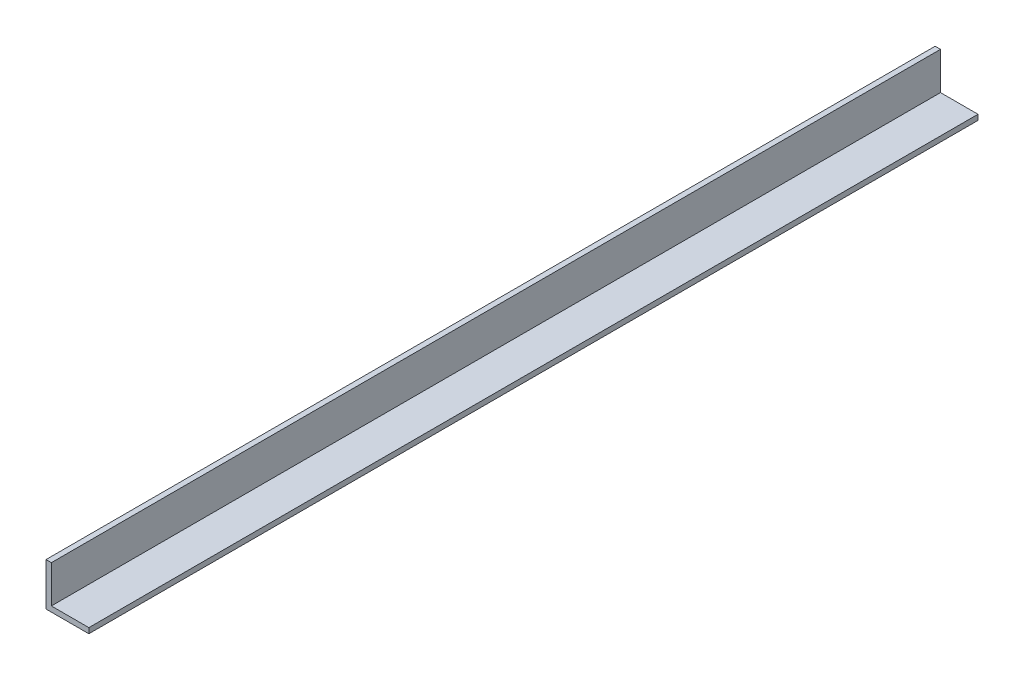
ISO-10303-21;
HEADER;
FILE_DESCRIPTION(('STEP AP214'),'2;1');
FILE_NAME('part.step','',(''),(''),'','','');
FILE_SCHEMA(('AUTOMOTIVE_DESIGN { 1 0 10303 214 1 1 1 1 }'));
ENDSEC;
DATA;
#1=APPLICATION_CONTEXT('core data for automotive mechanical design processes');
#2=APPLICATION_PROTOCOL_DEFINITION('international standard','automotive_design',2000,#1);
#3=PRODUCT_CONTEXT('',#1,'mechanical');
#4=PRODUCT('Part','Part','',(#3));
#5=PRODUCT_RELATED_PRODUCT_CATEGORY('part','',(#4));
#6=PRODUCT_DEFINITION_FORMATION('','',#4);
#7=PRODUCT_DEFINITION_CONTEXT('part definition',#1,'design');
#8=PRODUCT_DEFINITION('design','',#6,#7);
#9=PRODUCT_DEFINITION_SHAPE('','',#8);
#10=(LENGTH_UNIT() NAMED_UNIT(*) SI_UNIT(.MILLI.,.METRE.));
#11=(NAMED_UNIT(*) PLANE_ANGLE_UNIT() SI_UNIT($,.RADIAN.));
#12=(NAMED_UNIT(*) SI_UNIT($,.STERADIAN.) SOLID_ANGLE_UNIT());
#13=UNCERTAINTY_MEASURE_WITH_UNIT(LENGTH_MEASURE(1.E-05),#10,'distance_accuracy_value','');
#14=(GEOMETRIC_REPRESENTATION_CONTEXT(3) GLOBAL_UNCERTAINTY_ASSIGNED_CONTEXT((#13)) GLOBAL_UNIT_ASSIGNED_CONTEXT((#10,
#11,#12)) REPRESENTATION_CONTEXT('',''));
#15=CARTESIAN_POINT('',(0.,0.,0.));
#16=DIRECTION('',(0.,0.,1.));
#17=DIRECTION('',(1.,0.,0.));
#18=AXIS2_PLACEMENT_3D('',#15,#16,#17);
#19=CARTESIAN_POINT('',(0.,0.,527.05));
#20=DIRECTION('',(1.,0.,0.));
#21=DIRECTION('',(0.,0.,-1.));
#22=AXIS2_PLACEMENT_3D('',#19,#20,#21);
#23=PLANE('',#22);
#24=DIRECTION('',(0.,-1.,0.));
#25=VECTOR('',#24,1.);
#26=CARTESIAN_POINT('',(0.,0.,0.));
#27=LINE('',#26,#25);
#28=CARTESIAN_POINT('',(0.,0.,0.));
#29=VERTEX_POINT('',#28);
#30=CARTESIAN_POINT('',(0.,-25.4,0.));
#31=VERTEX_POINT('',#30);
#32=EDGE_CURVE('E117',#29,#31,#27,.T.);
#33=ORIENTED_EDGE('',*,*,#32,.T.);
#34=DIRECTION('',(0.,0.,-1.));
#35=VECTOR('',#34,1.);
#36=CARTESIAN_POINT('',(0.,-25.4,527.05));
#37=LINE('',#36,#35);
#38=CARTESIAN_POINT('',(0.,-25.4,527.05));
#39=VERTEX_POINT('',#38);
#40=EDGE_CURVE('E11',#39,#31,#37,.T.);
#41=ORIENTED_EDGE('',*,*,#40,.F.);
#42=DIRECTION('',(0.,-1.,0.));
#43=VECTOR('',#42,1.);
#44=CARTESIAN_POINT('',(0.,0.,527.05));
#45=LINE('',#44,#43);
#46=CARTESIAN_POINT('',(0.,0.,527.05));
#47=VERTEX_POINT('',#46);
#48=EDGE_CURVE('E119',#47,#39,#45,.T.);
#49=ORIENTED_EDGE('',*,*,#48,.F.);
#50=DIRECTION('',(0.,0.,-1.));
#51=VECTOR('',#50,1.);
#52=CARTESIAN_POINT('',(0.,0.,527.05));
#53=LINE('',#52,#51);
#54=EDGE_CURVE('E126',#47,#29,#53,.T.);
#55=ORIENTED_EDGE('',*,*,#54,.T.);
#56=EDGE_LOOP('',(#33,#41,#49,#55));
#57=FACE_BOUND('',#56,.T.);
#58=ADVANCED_FACE('F33',(#57),#23,.F.);
#59=CARTESIAN_POINT('',(0.,-25.4,527.05));
#60=DIRECTION('',(0.,1.,0.));
#61=DIRECTION('',(0.,0.,1.));
#62=AXIS2_PLACEMENT_3D('',#59,#60,#61);
#63=PLANE('',#62);
#64=DIRECTION('',(1.,0.,0.));
#65=VECTOR('',#64,1.);
#66=CARTESIAN_POINT('',(0.,-25.4,0.));
#67=LINE('',#66,#65);
#68=CARTESIAN_POINT('',(25.4,-25.4,0.));
#69=VERTEX_POINT('',#68);
#70=EDGE_CURVE('E129',#31,#69,#67,.T.);
#71=ORIENTED_EDGE('',*,*,#70,.T.);
#72=DIRECTION('',(0.,0.,-1.));
#73=VECTOR('',#72,1.);
#74=CARTESIAN_POINT('',(25.4,-25.4,527.05));
#75=LINE('',#74,#73);
#76=CARTESIAN_POINT('',(25.4,-25.4,527.05));
#77=VERTEX_POINT('',#76);
#78=EDGE_CURVE('E40',#77,#69,#75,.T.);
#79=ORIENTED_EDGE('',*,*,#78,.F.);
#80=DIRECTION('',(1.,0.,0.));
#81=VECTOR('',#80,1.);
#82=CARTESIAN_POINT('',(0.,-25.4,527.05));
#83=LINE('',#82,#81);
#84=EDGE_CURVE('E79',#39,#77,#83,.T.);
#85=ORIENTED_EDGE('',*,*,#84,.F.);
#86=ORIENTED_EDGE('',*,*,#40,.T.);
#87=EDGE_LOOP('',(#71,#79,#85,#86));
#88=FACE_BOUND('',#87,.T.);
#89=ADVANCED_FACE('F139',(#88),#63,.F.);
#90=CARTESIAN_POINT('',(25.4,0.,527.05));
#91=DIRECTION('',(-1.,0.,0.));
#92=DIRECTION('',(0.,-1.,0.));
#93=AXIS2_PLACEMENT_3D('',#90,#91,#92);
#94=PLANE('',#93);
#95=DIRECTION('',(0.,1.,0.));
#96=VECTOR('',#95,1.);
#97=CARTESIAN_POINT('',(25.4,0.,0.));
#98=LINE('',#97,#96);
#99=CARTESIAN_POINT('',(25.4,-22.225,0.));
#100=VERTEX_POINT('',#99);
#101=EDGE_CURVE('E131',#69,#100,#98,.T.);
#102=ORIENTED_EDGE('',*,*,#101,.T.);
#103=DIRECTION('',(0.,0.,1.));
#104=VECTOR('',#103,1.);
#105=CARTESIAN_POINT('',(25.4,-22.225,0.));
#106=LINE('',#105,#104);
#107=CARTESIAN_POINT('',(25.4,-22.225,527.05));
#108=VERTEX_POINT('',#107);
#109=EDGE_CURVE('E47',#100,#108,#106,.T.);
#110=ORIENTED_EDGE('',*,*,#109,.T.);
#111=DIRECTION('',(0.,1.,0.));
#112=VECTOR('',#111,1.);
#113=CARTESIAN_POINT('',(25.4,0.,527.05));
#114=LINE('',#113,#112);
#115=EDGE_CURVE('E122',#77,#108,#114,.T.);
#116=ORIENTED_EDGE('',*,*,#115,.F.);
#117=ORIENTED_EDGE('',*,*,#78,.T.);
#118=EDGE_LOOP('',(#102,#110,#116,#117));
#119=FACE_BOUND('',#118,.T.);
#120=ADVANCED_FACE('F137',(#119),#94,.F.);
#121=CARTESIAN_POINT('',(0.,0.,527.05));
#122=DIRECTION('',(0.,-1.,0.));
#123=DIRECTION('',(0.,0.,-1.));
#124=AXIS2_PLACEMENT_3D('',#121,#122,#123);
#125=PLANE('',#124);
#126=DIRECTION('',(-1.,0.,0.));
#127=VECTOR('',#126,1.);
#128=CARTESIAN_POINT('',(0.,0.,527.05));
#129=LINE('',#128,#127);
#130=CARTESIAN_POINT('',(3.175,0.,527.05));
#131=VERTEX_POINT('',#130);
#132=EDGE_CURVE('E56',#131,#47,#129,.T.);
#133=ORIENTED_EDGE('',*,*,#132,.F.);
#134=DIRECTION('',(0.,0.,1.));
#135=VECTOR('',#134,1.);
#136=CARTESIAN_POINT('',(3.175,0.,0.));
#137=LINE('',#136,#135);
#138=CARTESIAN_POINT('',(3.175,0.,0.));
#139=VERTEX_POINT('',#138);
#140=EDGE_CURVE('E115',#139,#131,#137,.T.);
#141=ORIENTED_EDGE('',*,*,#140,.F.);
#142=DIRECTION('',(-1.,0.,0.));
#143=VECTOR('',#142,1.);
#144=CARTESIAN_POINT('',(0.,0.,0.));
#145=LINE('',#144,#143);
#146=EDGE_CURVE('E74',#139,#29,#145,.T.);
#147=ORIENTED_EDGE('',*,*,#146,.T.);
#148=ORIENTED_EDGE('',*,*,#54,.F.);
#149=EDGE_LOOP('',(#133,#141,#147,#148));
#150=FACE_BOUND('',#149,.T.);
#151=ADVANCED_FACE('F142',(#150),#125,.F.);
#152=CARTESIAN_POINT('',(0.,0.,527.05));
#153=DIRECTION('',(0.,0.,1.));
#154=DIRECTION('',(1.,0.,0.));
#155=AXIS2_PLACEMENT_3D('',#152,#153,#154);
#156=PLANE('',#155);
#157=DIRECTION('',(0.,-1.,0.));
#158=VECTOR('',#157,1.);
#159=CARTESIAN_POINT('',(3.175,0.,527.05));
#160=LINE('',#159,#158);
#161=CARTESIAN_POINT('',(3.175,-22.225,527.05));
#162=VERTEX_POINT('',#161);
#163=EDGE_CURVE('E99',#131,#162,#160,.T.);
#164=ORIENTED_EDGE('',*,*,#163,.F.);
#165=ORIENTED_EDGE('',*,*,#132,.T.);
#166=ORIENTED_EDGE('',*,*,#48,.T.);
#167=ORIENTED_EDGE('',*,*,#84,.T.);
#168=ORIENTED_EDGE('',*,*,#115,.T.);
#169=DIRECTION('',(1.,0.,0.));
#170=VECTOR('',#169,1.);
#171=CARTESIAN_POINT('',(3.175,-22.225,527.05));
#172=LINE('',#171,#170);
#173=EDGE_CURVE('E110',#162,#108,#172,.T.);
#174=ORIENTED_EDGE('',*,*,#173,.F.);
#175=EDGE_LOOP('',(#164,#165,#166,#167,#168,#174));
#176=FACE_BOUND('',#175,.T.);
#177=ADVANCED_FACE('F143',(#176),#156,.T.);
#178=CARTESIAN_POINT('',(0.,0.,0.));
#179=DIRECTION('',(0.,0.,1.));
#180=DIRECTION('',(1.,0.,0.));
#181=AXIS2_PLACEMENT_3D('',#178,#179,#180);
#182=PLANE('',#181);
#183=ORIENTED_EDGE('',*,*,#146,.F.);
#184=DIRECTION('',(0.,-1.,0.));
#185=VECTOR('',#184,1.);
#186=CARTESIAN_POINT('',(3.175,0.,0.));
#187=LINE('',#186,#185);
#188=CARTESIAN_POINT('',(3.175,-22.225,0.));
#189=VERTEX_POINT('',#188);
#190=EDGE_CURVE('E98',#139,#189,#187,.T.);
#191=ORIENTED_EDGE('',*,*,#190,.T.);
#192=DIRECTION('',(1.,0.,0.));
#193=VECTOR('',#192,1.);
#194=CARTESIAN_POINT('',(3.175,-22.225,0.));
#195=LINE('',#194,#193);
#196=EDGE_CURVE('E101',#189,#100,#195,.T.);
#197=ORIENTED_EDGE('',*,*,#196,.T.);
#198=ORIENTED_EDGE('',*,*,#101,.F.);
#199=ORIENTED_EDGE('',*,*,#70,.F.);
#200=ORIENTED_EDGE('',*,*,#32,.F.);
#201=EDGE_LOOP('',(#183,#191,#197,#198,#199,#200));
#202=FACE_BOUND('',#201,.T.);
#203=ADVANCED_FACE('F108',(#202),#182,.F.);
#204=CARTESIAN_POINT('',(3.175,0.,0.));
#205=DIRECTION('',(-1.,0.,0.));
#206=DIRECTION('',(0.,-1.,0.));
#207=AXIS2_PLACEMENT_3D('',#204,#205,#206);
#208=PLANE('',#207);
#209=ORIENTED_EDGE('',*,*,#163,.T.);
#210=DIRECTION('',(0.,0.,1.));
#211=VECTOR('',#210,1.);
#212=CARTESIAN_POINT('',(3.175,-22.225,0.));
#213=LINE('',#212,#211);
#214=EDGE_CURVE('E95',#189,#162,#213,.T.);
#215=ORIENTED_EDGE('',*,*,#214,.F.);
#216=ORIENTED_EDGE('',*,*,#190,.F.);
#217=ORIENTED_EDGE('',*,*,#140,.T.);
#218=EDGE_LOOP('',(#209,#215,#216,#217));
#219=FACE_BOUND('',#218,.T.);
#220=ADVANCED_FACE('F96',(#219),#208,.F.);
#221=CARTESIAN_POINT('',(3.175,-22.225,0.));
#222=DIRECTION('',(0.,-1.,0.));
#223=DIRECTION('',(0.,0.,-1.));
#224=AXIS2_PLACEMENT_3D('',#221,#222,#223);
#225=PLANE('',#224);
#226=ORIENTED_EDGE('',*,*,#173,.T.);
#227=ORIENTED_EDGE('',*,*,#109,.F.);
#228=ORIENTED_EDGE('',*,*,#196,.F.);
#229=ORIENTED_EDGE('',*,*,#214,.T.);
#230=EDGE_LOOP('',(#226,#227,#228,#229));
#231=FACE_BOUND('',#230,.T.);
#232=ADVANCED_FACE('F103',(#231),#225,.F.);
#233=CLOSED_SHELL('',(#58,#89,#120,#151,#177,#203,#220,#232));
#234=MANIFOLD_SOLID_BREP('B2',#233);
#235=ADVANCED_BREP_SHAPE_REPRESENTATION('',(#18,#234),#14);
#236=SHAPE_DEFINITION_REPRESENTATION(#9,#235);
ENDSEC;
END-ISO-10303-21;
